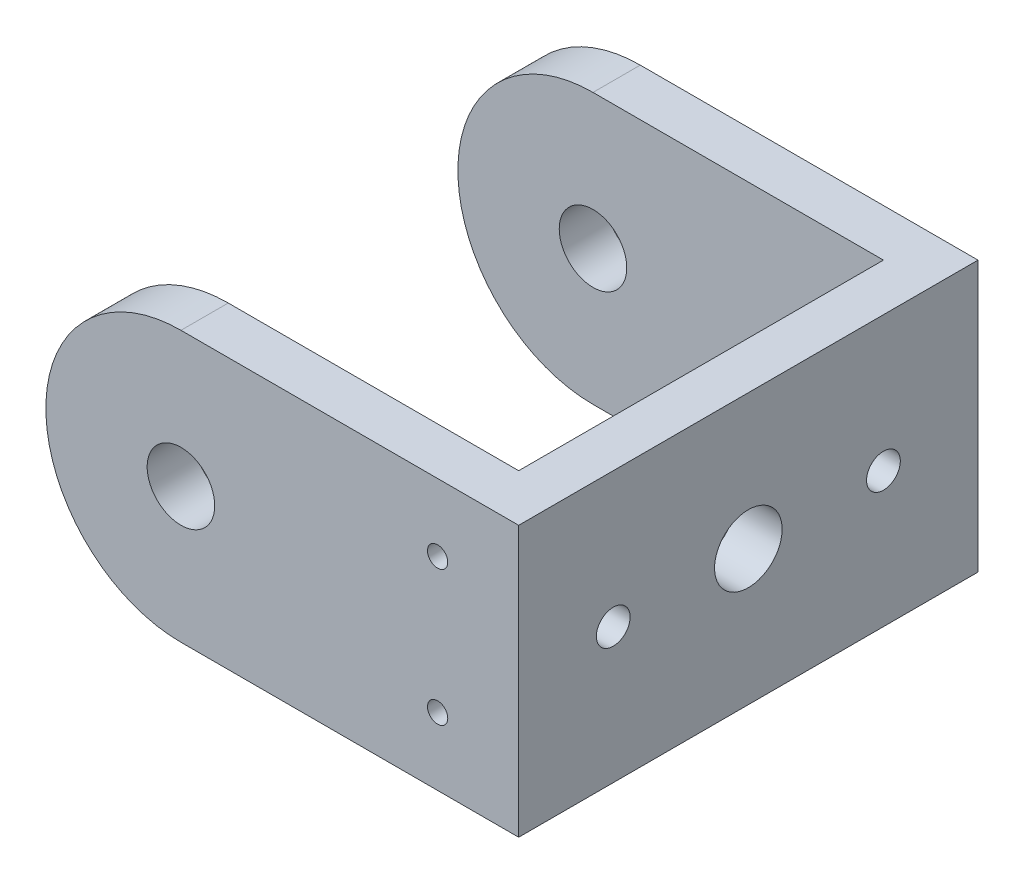
ISO-10303-21;
HEADER;
FILE_DESCRIPTION(('STEP AP214'),'2;1');
FILE_NAME('part.step','',(''),(''),'','','');
FILE_SCHEMA(('AUTOMOTIVE_DESIGN { 1 0 10303 214 1 1 1 1 }'));
ENDSEC;
DATA;
#1=APPLICATION_CONTEXT('core data for automotive mechanical design processes');
#2=APPLICATION_PROTOCOL_DEFINITION('international standard','automotive_design',2000,#1);
#3=PRODUCT_CONTEXT('',#1,'mechanical');
#4=PRODUCT('Part','Part','',(#3));
#5=PRODUCT_RELATED_PRODUCT_CATEGORY('part','',(#4));
#6=PRODUCT_DEFINITION_FORMATION('','',#4);
#7=PRODUCT_DEFINITION_CONTEXT('part definition',#1,'design');
#8=PRODUCT_DEFINITION('design','',#6,#7);
#9=PRODUCT_DEFINITION_SHAPE('','',#8);
#10=(LENGTH_UNIT() NAMED_UNIT(*) SI_UNIT(.MILLI.,.METRE.));
#11=(NAMED_UNIT(*) PLANE_ANGLE_UNIT() SI_UNIT($,.RADIAN.));
#12=(NAMED_UNIT(*) SI_UNIT($,.STERADIAN.) SOLID_ANGLE_UNIT());
#13=UNCERTAINTY_MEASURE_WITH_UNIT(LENGTH_MEASURE(1.E-05),#10,'distance_accuracy_value','');
#14=(GEOMETRIC_REPRESENTATION_CONTEXT(3) GLOBAL_UNCERTAINTY_ASSIGNED_CONTEXT((#13)) GLOBAL_UNIT_ASSIGNED_CONTEXT((#10,
#11,#12)) REPRESENTATION_CONTEXT('',''));
#15=CARTESIAN_POINT('',(0.,0.,0.));
#16=DIRECTION('',(0.,0.,1.));
#17=DIRECTION('',(1.,0.,0.));
#18=AXIS2_PLACEMENT_3D('',#15,#16,#17);
#19=CARTESIAN_POINT('',(-50.,-20.,68.));
#20=DIRECTION('',(0.,0.,-1.));
#21=DIRECTION('',(-1.,0.,0.));
#22=AXIS2_PLACEMENT_3D('',#19,#20,#21);
#23=CYLINDRICAL_SURFACE('',#22,20.);
#24=DIRECTION('',(0.,0.,-1.));
#25=VECTOR('',#24,1.);
#26=CARTESIAN_POINT('',(-50.,-40.,68.));
#27=LINE('',#26,#25);
#28=CARTESIAN_POINT('',(-50.,-40.,6.99999999999999));
#29=VERTEX_POINT('',#28);
#30=CARTESIAN_POINT('',(-50.,-40.,0.));
#31=VERTEX_POINT('',#30);
#32=EDGE_CURVE('E175',#29,#31,#27,.T.);
#33=ORIENTED_EDGE('',*,*,#32,.F.);
#34=CARTESIAN_POINT('',(-50.,-20.,6.99999999999999));
#35=DIRECTION('',(0.,0.,-1.));
#36=DIRECTION('',(-1.,0.,0.));
#37=AXIS2_PLACEMENT_3D('',#34,#35,#36);
#38=CIRCLE('',#37,20.);
#39=CARTESIAN_POINT('',(-50.,0.,6.99999999999999));
#40=VERTEX_POINT('',#39);
#41=EDGE_CURVE('E126',#29,#40,#38,.T.);
#42=ORIENTED_EDGE('',*,*,#41,.T.);
#43=DIRECTION('',(0.,0.,-1.));
#44=VECTOR('',#43,1.);
#45=CARTESIAN_POINT('',(-50.,0.,68.));
#46=LINE('',#45,#44);
#47=CARTESIAN_POINT('',(-50.,0.,0.));
#48=VERTEX_POINT('',#47);
#49=EDGE_CURVE('E46',#40,#48,#46,.T.);
#50=ORIENTED_EDGE('',*,*,#49,.T.);
#51=CARTESIAN_POINT('',(-50.,-20.,0.));
#52=DIRECTION('',(0.,0.,1.));
#53=DIRECTION('',(-1.,0.,0.));
#54=AXIS2_PLACEMENT_3D('',#51,#52,#53);
#55=CIRCLE('',#54,20.);
#56=EDGE_CURVE('E166',#48,#31,#55,.T.);
#57=ORIENTED_EDGE('',*,*,#56,.T.);
#58=EDGE_LOOP('',(#33,#42,#50,#57));
#59=FACE_BOUND('',#58,.T.);
#60=ADVANCED_FACE('F37',(#59),#23,.T.);
#61=CARTESIAN_POINT('',(-50.,-20.,68.));
#62=DIRECTION('',(0.,0.,-1.));
#63=DIRECTION('',(-1.,0.,0.));
#64=AXIS2_PLACEMENT_3D('',#61,#62,#63);
#65=CYLINDRICAL_SURFACE('',#64,5.);
#66=CARTESIAN_POINT('',(-50.,-20.,6.99999999999999));
#67=DIRECTION('',(0.,0.,-1.));
#68=DIRECTION('',(-1.,0.,0.));
#69=AXIS2_PLACEMENT_3D('',#66,#67,#68);
#70=CIRCLE('',#69,5.);
#71=CARTESIAN_POINT('',(-55.,-20.,6.99999999999999));
#72=VERTEX_POINT('',#71);
#73=EDGE_CURVE('E148',#72,#72,#70,.T.);
#74=ORIENTED_EDGE('',*,*,#73,.F.);
#75=EDGE_LOOP('',(#74));
#76=FACE_BOUND('',#75,.T.);
#77=CARTESIAN_POINT('',(-50.,-20.,0.));
#78=DIRECTION('',(0.,0.,1.));
#79=DIRECTION('',(1.,0.,0.));
#80=AXIS2_PLACEMENT_3D('',#77,#78,#79);
#81=CIRCLE('',#80,5.);
#82=CARTESIAN_POINT('',(-45.,-20.,0.));
#83=VERTEX_POINT('',#82);
#84=EDGE_CURVE('E150',#83,#83,#81,.T.);
#85=ORIENTED_EDGE('',*,*,#84,.F.);
#86=EDGE_LOOP('',(#85));
#87=FACE_BOUND('',#86,.T.);
#88=ADVANCED_FACE('F237',(#76,#87),#65,.F.);
#89=CARTESIAN_POINT('',(-50.,-20.,68.));
#90=DIRECTION('',(0.,0.,-1.));
#91=DIRECTION('',(-1.,0.,0.));
#92=AXIS2_PLACEMENT_3D('',#89,#90,#91);
#93=PLANE('',#92);
#94=CARTESIAN_POINT('',(-12.,-10.,68.));
#95=DIRECTION('',(0.,0.,-1.));
#96=DIRECTION('',(-1.,0.,0.));
#97=AXIS2_PLACEMENT_3D('',#94,#95,#96);
#98=CIRCLE('',#97,1.5);
#99=CARTESIAN_POINT('',(-13.5,-10.,68.));
#100=VERTEX_POINT('',#99);
#101=EDGE_CURVE('E193',#100,#100,#98,.T.);
#102=ORIENTED_EDGE('',*,*,#101,.T.);
#103=EDGE_LOOP('',(#102));
#104=FACE_BOUND('',#103,.T.);
#105=CARTESIAN_POINT('',(-12.,-30.,68.));
#106=DIRECTION('',(0.,0.,-1.));
#107=DIRECTION('',(1.,0.,0.));
#108=AXIS2_PLACEMENT_3D('',#105,#106,#107);
#109=CIRCLE('',#108,1.5);
#110=CARTESIAN_POINT('',(-10.5,-30.,68.));
#111=VERTEX_POINT('',#110);
#112=EDGE_CURVE('E209',#111,#111,#109,.T.);
#113=ORIENTED_EDGE('',*,*,#112,.T.);
#114=EDGE_LOOP('',(#113));
#115=FACE_BOUND('',#114,.T.);
#116=DIRECTION('',(-1.,0.,0.));
#117=VECTOR('',#116,1.);
#118=CARTESIAN_POINT('',(-50.,0.,68.));
#119=LINE('',#118,#117);
#120=CARTESIAN_POINT('',(0.,0.,68.));
#121=VERTEX_POINT('',#120);
#122=CARTESIAN_POINT('',(-50.,0.,68.));
#123=VERTEX_POINT('',#122);
#124=EDGE_CURVE('E157',#121,#123,#119,.T.);
#125=ORIENTED_EDGE('',*,*,#124,.T.);
#126=CARTESIAN_POINT('',(-50.,-20.,68.));
#127=DIRECTION('',(0.,0.,1.));
#128=DIRECTION('',(-1.,0.,0.));
#129=AXIS2_PLACEMENT_3D('',#126,#127,#128);
#130=CIRCLE('',#129,20.);
#131=CARTESIAN_POINT('',(-50.,-40.,68.));
#132=VERTEX_POINT('',#131);
#133=EDGE_CURVE('E91',#123,#132,#130,.T.);
#134=ORIENTED_EDGE('',*,*,#133,.T.);
#135=DIRECTION('',(1.,0.,0.));
#136=VECTOR('',#135,1.);
#137=CARTESIAN_POINT('',(0.,-40.,68.));
#138=LINE('',#137,#136);
#139=CARTESIAN_POINT('',(0.,-40.,68.));
#140=VERTEX_POINT('',#139);
#141=EDGE_CURVE('E160',#132,#140,#138,.T.);
#142=ORIENTED_EDGE('',*,*,#141,.T.);
#143=DIRECTION('',(0.,1.,0.));
#144=VECTOR('',#143,1.);
#145=CARTESIAN_POINT('',(0.,0.,68.));
#146=LINE('',#145,#144);
#147=EDGE_CURVE('E63',#140,#121,#146,.T.);
#148=ORIENTED_EDGE('',*,*,#147,.T.);
#149=EDGE_LOOP('',(#125,#134,#142,#148));
#150=FACE_BOUND('',#149,.T.);
#151=CARTESIAN_POINT('',(-50.,-20.,68.));
#152=DIRECTION('',(0.,0.,1.));
#153=DIRECTION('',(1.,0.,0.));
#154=AXIS2_PLACEMENT_3D('',#151,#152,#153);
#155=CIRCLE('',#154,5.);
#156=CARTESIAN_POINT('',(-45.,-20.,68.));
#157=VERTEX_POINT('',#156);
#158=EDGE_CURVE('E151',#157,#157,#155,.T.);
#159=ORIENTED_EDGE('',*,*,#158,.F.);
#160=EDGE_LOOP('',(#159));
#161=FACE_BOUND('',#160,.T.);
#162=ADVANCED_FACE('F248',(#104,#115,#150,#161),#93,.F.);
#163=CARTESIAN_POINT('',(-50.,-20.,0.));
#164=DIRECTION('',(0.,0.,-1.));
#165=DIRECTION('',(-1.,0.,0.));
#166=AXIS2_PLACEMENT_3D('',#163,#164,#165);
#167=PLANE('',#166);
#168=CARTESIAN_POINT('',(-12.,-10.,0.));
#169=DIRECTION('',(0.,0.,-1.));
#170=DIRECTION('',(-1.,0.,0.));
#171=AXIS2_PLACEMENT_3D('',#168,#169,#170);
#172=CIRCLE('',#171,1.5);
#173=CARTESIAN_POINT('',(-13.5,-10.,0.));
#174=VERTEX_POINT('',#173);
#175=EDGE_CURVE('E199',#174,#174,#172,.T.);
#176=ORIENTED_EDGE('',*,*,#175,.F.);
#177=EDGE_LOOP('',(#176));
#178=FACE_BOUND('',#177,.T.);
#179=CARTESIAN_POINT('',(-12.,-30.,0.));
#180=DIRECTION('',(0.,0.,-1.));
#181=DIRECTION('',(1.,0.,0.));
#182=AXIS2_PLACEMENT_3D('',#179,#180,#181);
#183=CIRCLE('',#182,1.5);
#184=CARTESIAN_POINT('',(-10.5,-30.,0.));
#185=VERTEX_POINT('',#184);
#186=EDGE_CURVE('E204',#185,#185,#183,.T.);
#187=ORIENTED_EDGE('',*,*,#186,.F.);
#188=EDGE_LOOP('',(#187));
#189=FACE_BOUND('',#188,.T.);
#190=DIRECTION('',(-1.,0.,0.));
#191=VECTOR('',#190,1.);
#192=CARTESIAN_POINT('',(-50.,0.,0.));
#193=LINE('',#192,#191);
#194=CARTESIAN_POINT('',(0.,0.,0.));
#195=VERTEX_POINT('',#194);
#196=EDGE_CURVE('E154',#195,#48,#193,.T.);
#197=ORIENTED_EDGE('',*,*,#196,.F.);
#198=DIRECTION('',(0.,1.,0.));
#199=VECTOR('',#198,1.);
#200=CARTESIAN_POINT('',(0.,0.,0.));
#201=LINE('',#200,#199);
#202=CARTESIAN_POINT('',(0.,-40.,0.));
#203=VERTEX_POINT('',#202);
#204=EDGE_CURVE('E84',#203,#195,#201,.T.);
#205=ORIENTED_EDGE('',*,*,#204,.F.);
#206=DIRECTION('',(1.,0.,0.));
#207=VECTOR('',#206,1.);
#208=CARTESIAN_POINT('',(0.,-40.,0.));
#209=LINE('',#208,#207);
#210=EDGE_CURVE('E169',#31,#203,#209,.T.);
#211=ORIENTED_EDGE('',*,*,#210,.F.);
#212=ORIENTED_EDGE('',*,*,#56,.F.);
#213=EDGE_LOOP('',(#197,#205,#211,#212));
#214=FACE_BOUND('',#213,.T.);
#215=ORIENTED_EDGE('',*,*,#84,.T.);
#216=EDGE_LOOP('',(#215));
#217=FACE_BOUND('',#216,.T.);
#218=ADVANCED_FACE('F254',(#178,#189,#214,#217),#167,.T.);
#219=CARTESIAN_POINT('',(-50.,0.,68.));
#220=DIRECTION('',(0.,-1.,0.));
#221=DIRECTION('',(0.,0.,-1.));
#222=AXIS2_PLACEMENT_3D('',#219,#220,#221);
#223=PLANE('',#222);
#224=ORIENTED_EDGE('',*,*,#49,.F.);
#225=DIRECTION('',(-1.,0.,0.));
#226=VECTOR('',#225,1.);
#227=CARTESIAN_POINT('',(-75.7688155447121,0.,7.));
#228=LINE('',#227,#226);
#229=CARTESIAN_POINT('',(-7.00000000000003,0.,6.99999999999997));
#230=VERTEX_POINT('',#229);
#231=EDGE_CURVE('E135',#230,#40,#228,.T.);
#232=ORIENTED_EDGE('',*,*,#231,.F.);
#233=DIRECTION('',(0.,0.,-1.));
#234=VECTOR('',#233,1.);
#235=CARTESIAN_POINT('',(-7.00000000000003,0.,6.99999999999997));
#236=LINE('',#235,#234);
#237=CARTESIAN_POINT('',(-7.00000000000002,0.,61.));
#238=VERTEX_POINT('',#237);
#239=EDGE_CURVE('E116',#238,#230,#236,.T.);
#240=ORIENTED_EDGE('',*,*,#239,.F.);
#241=DIRECTION('',(1.,0.,0.));
#242=VECTOR('',#241,1.);
#243=CARTESIAN_POINT('',(-75.7688155447121,0.,61.));
#244=LINE('',#243,#242);
#245=CARTESIAN_POINT('',(-50.,0.,61.));
#246=VERTEX_POINT('',#245);
#247=EDGE_CURVE('E139',#246,#238,#244,.T.);
#248=ORIENTED_EDGE('',*,*,#247,.F.);
#249=EDGE_CURVE('E11',#123,#246,#46,.T.);
#250=ORIENTED_EDGE('',*,*,#249,.F.);
#251=ORIENTED_EDGE('',*,*,#124,.F.);
#252=DIRECTION('',(0.,0.,-1.));
#253=VECTOR('',#252,1.);
#254=CARTESIAN_POINT('',(0.,0.,68.));
#255=LINE('',#254,#253);
#256=EDGE_CURVE('E163',#121,#195,#255,.T.);
#257=ORIENTED_EDGE('',*,*,#256,.T.);
#258=ORIENTED_EDGE('',*,*,#196,.T.);
#259=EDGE_LOOP('',(#224,#232,#240,#248,#250,#251,#257,#258));
#260=FACE_BOUND('',#259,.T.);
#261=ADVANCED_FACE('F39',(#260),#223,.F.);
#262=ORIENTED_EDGE('',*,*,#249,.T.);
#263=CARTESIAN_POINT('',(-50.,-20.,61.));
#264=DIRECTION('',(0.,0.,1.));
#265=DIRECTION('',(1.,0.,0.));
#266=AXIS2_PLACEMENT_3D('',#263,#264,#265);
#267=CIRCLE('',#266,20.);
#268=CARTESIAN_POINT('',(-50.,-40.,61.));
#269=VERTEX_POINT('',#268);
#270=EDGE_CURVE('E145',#246,#269,#267,.T.);
#271=ORIENTED_EDGE('',*,*,#270,.T.);
#272=EDGE_CURVE('E176',#132,#269,#27,.T.);
#273=ORIENTED_EDGE('',*,*,#272,.F.);
#274=ORIENTED_EDGE('',*,*,#133,.F.);
#275=EDGE_LOOP('',(#262,#271,#273,#274));
#276=FACE_BOUND('',#275,.T.);
#277=ADVANCED_FACE('F238',(#276),#23,.T.);
#278=CARTESIAN_POINT('',(0.,-40.,68.));
#279=DIRECTION('',(0.,1.,0.));
#280=DIRECTION('',(-1.,0.,0.));
#281=AXIS2_PLACEMENT_3D('',#278,#279,#280);
#282=PLANE('',#281);
#283=DIRECTION('',(0.,0.,-1.));
#284=VECTOR('',#283,1.);
#285=CARTESIAN_POINT('',(-7.00000000000003,-40.,6.99999999999997));
#286=LINE('',#285,#284);
#287=CARTESIAN_POINT('',(-7.00000000000002,-40.,61.));
#288=VERTEX_POINT('',#287);
#289=CARTESIAN_POINT('',(-7.00000000000003,-40.,6.99999999999997));
#290=VERTEX_POINT('',#289);
#291=EDGE_CURVE('E54',#288,#290,#286,.T.);
#292=ORIENTED_EDGE('',*,*,#291,.T.);
#293=DIRECTION('',(-1.,0.,0.));
#294=VECTOR('',#293,1.);
#295=CARTESIAN_POINT('',(-75.7688155447121,-40.,7.));
#296=LINE('',#295,#294);
#297=EDGE_CURVE('E123',#290,#29,#296,.T.);
#298=ORIENTED_EDGE('',*,*,#297,.T.);
#299=ORIENTED_EDGE('',*,*,#32,.T.);
#300=ORIENTED_EDGE('',*,*,#210,.T.);
#301=DIRECTION('',(0.,0.,-1.));
#302=VECTOR('',#301,1.);
#303=CARTESIAN_POINT('',(0.,-40.,68.));
#304=LINE('',#303,#302);
#305=EDGE_CURVE('E173',#140,#203,#304,.T.);
#306=ORIENTED_EDGE('',*,*,#305,.F.);
#307=ORIENTED_EDGE('',*,*,#141,.F.);
#308=ORIENTED_EDGE('',*,*,#272,.T.);
#309=DIRECTION('',(1.,0.,0.));
#310=VECTOR('',#309,1.);
#311=CARTESIAN_POINT('',(-75.7688155447121,-40.,61.));
#312=LINE('',#311,#310);
#313=EDGE_CURVE('E133',#269,#288,#312,.T.);
#314=ORIENTED_EDGE('',*,*,#313,.T.);
#315=EDGE_LOOP('',(#292,#298,#299,#300,#306,#307,#308,#314));
#316=FACE_BOUND('',#315,.T.);
#317=ADVANCED_FACE('F131',(#316),#282,.F.);
#318=CARTESIAN_POINT('',(0.,0.,68.));
#319=DIRECTION('',(-1.,0.,0.));
#320=DIRECTION('',(0.,-1.,0.));
#321=AXIS2_PLACEMENT_3D('',#318,#319,#320);
#322=PLANE('',#321);
#323=CARTESIAN_POINT('',(0.,-20.,14.));
#324=DIRECTION('',(1.,0.,0.));
#325=DIRECTION('',(0.,-1.,0.));
#326=AXIS2_PLACEMENT_3D('',#323,#324,#325);
#327=CIRCLE('',#326,2.5);
#328=CARTESIAN_POINT('',(0.,-22.5,14.));
#329=VERTEX_POINT('',#328);
#330=EDGE_CURVE('E215',#329,#329,#327,.T.);
#331=ORIENTED_EDGE('',*,*,#330,.F.);
#332=EDGE_LOOP('',(#331));
#333=FACE_BOUND('',#332,.T.);
#334=CARTESIAN_POINT('',(0.,-20.,54.));
#335=DIRECTION('',(1.,0.,0.));
#336=DIRECTION('',(0.,1.,0.));
#337=AXIS2_PLACEMENT_3D('',#334,#335,#336);
#338=CIRCLE('',#337,2.5);
#339=CARTESIAN_POINT('',(0.,-17.5,54.));
#340=VERTEX_POINT('',#339);
#341=EDGE_CURVE('E216',#340,#340,#338,.T.);
#342=ORIENTED_EDGE('',*,*,#341,.F.);
#343=EDGE_LOOP('',(#342));
#344=FACE_BOUND('',#343,.T.);
#345=CARTESIAN_POINT('',(0.,-20.,34.));
#346=DIRECTION('',(1.,0.,0.));
#347=DIRECTION('',(0.,1.,0.));
#348=AXIS2_PLACEMENT_3D('',#345,#346,#347);
#349=CIRCLE('',#348,5.);
#350=CARTESIAN_POINT('',(0.,-15.,34.));
#351=VERTEX_POINT('',#350);
#352=EDGE_CURVE('E186',#351,#351,#349,.T.);
#353=ORIENTED_EDGE('',*,*,#352,.F.);
#354=EDGE_LOOP('',(#353));
#355=FACE_BOUND('',#354,.T.);
#356=ORIENTED_EDGE('',*,*,#204,.T.);
#357=ORIENTED_EDGE('',*,*,#256,.F.);
#358=ORIENTED_EDGE('',*,*,#147,.F.);
#359=ORIENTED_EDGE('',*,*,#305,.T.);
#360=EDGE_LOOP('',(#356,#357,#358,#359));
#361=FACE_BOUND('',#360,.T.);
#362=ADVANCED_FACE('F226',(#333,#344,#355,#361),#322,.F.);
#363=CARTESIAN_POINT('',(-50.,-20.,61.));
#364=DIRECTION('',(0.,0.,1.));
#365=DIRECTION('',(1.,0.,0.));
#366=AXIS2_PLACEMENT_3D('',#363,#364,#365);
#367=CIRCLE('',#366,5.);
#368=CARTESIAN_POINT('',(-45.,-20.,61.));
#369=VERTEX_POINT('',#368);
#370=EDGE_CURVE('E119',#369,#369,#367,.T.);
#371=ORIENTED_EDGE('',*,*,#370,.F.);
#372=EDGE_LOOP('',(#371));
#373=FACE_BOUND('',#372,.T.);
#374=ORIENTED_EDGE('',*,*,#158,.T.);
#375=EDGE_LOOP('',(#374));
#376=FACE_BOUND('',#375,.T.);
#377=ADVANCED_FACE('F228',(#373,#376),#65,.F.);
#378=CARTESIAN_POINT('',(-75.7688155447121,-40.,7.));
#379=DIRECTION('',(0.,0.,-1.));
#380=DIRECTION('',(-1.,0.,0.));
#381=AXIS2_PLACEMENT_3D('',#378,#379,#380);
#382=PLANE('',#381);
#383=CARTESIAN_POINT('',(-12.,-10.,6.99999999999997));
#384=DIRECTION('',(0.,0.,-1.));
#385=DIRECTION('',(-1.,0.,0.));
#386=AXIS2_PLACEMENT_3D('',#383,#384,#385);
#387=CIRCLE('',#386,1.5);
#388=CARTESIAN_POINT('',(-13.5,-10.,6.99999999999997));
#389=VERTEX_POINT('',#388);
#390=EDGE_CURVE('E212',#389,#389,#387,.T.);
#391=ORIENTED_EDGE('',*,*,#390,.T.);
#392=EDGE_LOOP('',(#391));
#393=FACE_BOUND('',#392,.T.);
#394=CARTESIAN_POINT('',(-12.,-30.,6.99999999999997));
#395=DIRECTION('',(0.,0.,-1.));
#396=DIRECTION('',(-1.,0.,0.));
#397=AXIS2_PLACEMENT_3D('',#394,#395,#396);
#398=CIRCLE('',#397,1.5);
#399=CARTESIAN_POINT('',(-13.5,-30.,6.99999999999997));
#400=VERTEX_POINT('',#399);
#401=EDGE_CURVE('E192',#400,#400,#398,.T.);
#402=ORIENTED_EDGE('',*,*,#401,.T.);
#403=EDGE_LOOP('',(#402));
#404=FACE_BOUND('',#403,.T.);
#405=ORIENTED_EDGE('',*,*,#73,.T.);
#406=EDGE_LOOP('',(#405));
#407=FACE_BOUND('',#406,.T.);
#408=ORIENTED_EDGE('',*,*,#297,.F.);
#409=DIRECTION('',(0.,1.,0.));
#410=VECTOR('',#409,1.);
#411=CARTESIAN_POINT('',(-7.00000000000003,-40.,6.99999999999997));
#412=LINE('',#411,#410);
#413=EDGE_CURVE('E112',#290,#230,#412,.T.);
#414=ORIENTED_EDGE('',*,*,#413,.T.);
#415=ORIENTED_EDGE('',*,*,#231,.T.);
#416=ORIENTED_EDGE('',*,*,#41,.F.);
#417=EDGE_LOOP('',(#408,#414,#415,#416));
#418=FACE_BOUND('',#417,.T.);
#419=ADVANCED_FACE('F124',(#393,#404,#407,#418),#382,.F.);
#420=CARTESIAN_POINT('',(-75.7688155447121,-40.,61.));
#421=DIRECTION('',(0.,0.,1.));
#422=DIRECTION('',(1.,0.,0.));
#423=AXIS2_PLACEMENT_3D('',#420,#421,#422);
#424=PLANE('',#423);
#425=CARTESIAN_POINT('',(-12.,-10.,61.));
#426=DIRECTION('',(0.,0.,1.));
#427=DIRECTION('',(1.,0.,0.));
#428=AXIS2_PLACEMENT_3D('',#425,#426,#427);
#429=CIRCLE('',#428,1.5);
#430=CARTESIAN_POINT('',(-10.5,-10.,61.));
#431=VERTEX_POINT('',#430);
#432=EDGE_CURVE('E41',#431,#431,#429,.T.);
#433=ORIENTED_EDGE('',*,*,#432,.T.);
#434=EDGE_LOOP('',(#433));
#435=FACE_BOUND('',#434,.T.);
#436=CARTESIAN_POINT('',(-12.,-30.,61.));
#437=DIRECTION('',(0.,0.,1.));
#438=DIRECTION('',(1.,0.,0.));
#439=AXIS2_PLACEMENT_3D('',#436,#437,#438);
#440=CIRCLE('',#439,1.5);
#441=CARTESIAN_POINT('',(-10.5,-30.,61.));
#442=VERTEX_POINT('',#441);
#443=EDGE_CURVE('E190',#442,#442,#440,.T.);
#444=ORIENTED_EDGE('',*,*,#443,.T.);
#445=EDGE_LOOP('',(#444));
#446=FACE_BOUND('',#445,.T.);
#447=ORIENTED_EDGE('',*,*,#370,.T.);
#448=EDGE_LOOP('',(#447));
#449=FACE_BOUND('',#448,.T.);
#450=ORIENTED_EDGE('',*,*,#247,.T.);
#451=DIRECTION('',(0.,1.,0.));
#452=VECTOR('',#451,1.);
#453=CARTESIAN_POINT('',(-7.00000000000002,-40.,61.));
#454=LINE('',#453,#452);
#455=EDGE_CURVE('E120',#288,#238,#454,.T.);
#456=ORIENTED_EDGE('',*,*,#455,.F.);
#457=ORIENTED_EDGE('',*,*,#313,.F.);
#458=ORIENTED_EDGE('',*,*,#270,.F.);
#459=EDGE_LOOP('',(#450,#456,#457,#458));
#460=FACE_BOUND('',#459,.T.);
#461=ADVANCED_FACE('F261',(#435,#446,#449,#460),#424,.F.);
#462=CARTESIAN_POINT('',(-7.00000000000003,-40.,6.99999999999997));
#463=DIRECTION('',(1.,0.,0.));
#464=DIRECTION('',(0.,0.,-1.));
#465=AXIS2_PLACEMENT_3D('',#462,#463,#464);
#466=PLANE('',#465);
#467=CARTESIAN_POINT('',(-7.00000000000002,-20.,14.));
#468=DIRECTION('',(1.,0.,0.));
#469=DIRECTION('',(0.,0.,-1.));
#470=AXIS2_PLACEMENT_3D('',#467,#468,#469);
#471=CIRCLE('',#470,2.5);
#472=CARTESIAN_POINT('',(-7.00000000000002,-20.,11.5));
#473=VERTEX_POINT('',#472);
#474=EDGE_CURVE('E141',#473,#473,#471,.T.);
#475=ORIENTED_EDGE('',*,*,#474,.T.);
#476=EDGE_LOOP('',(#475));
#477=FACE_BOUND('',#476,.T.);
#478=CARTESIAN_POINT('',(-7.00000000000002,-20.,54.));
#479=DIRECTION('',(1.,0.,0.));
#480=DIRECTION('',(0.,0.,-1.));
#481=AXIS2_PLACEMENT_3D('',#478,#479,#480);
#482=CIRCLE('',#481,2.5);
#483=CARTESIAN_POINT('',(-7.00000000000002,-20.,51.5));
#484=VERTEX_POINT('',#483);
#485=EDGE_CURVE('E185',#484,#484,#482,.T.);
#486=ORIENTED_EDGE('',*,*,#485,.T.);
#487=EDGE_LOOP('',(#486));
#488=FACE_BOUND('',#487,.T.);
#489=CARTESIAN_POINT('',(-7.00000000000002,-20.,34.));
#490=DIRECTION('',(1.,0.,0.));
#491=DIRECTION('',(0.,0.,-1.));
#492=AXIS2_PLACEMENT_3D('',#489,#490,#491);
#493=CIRCLE('',#492,5.);
#494=CARTESIAN_POINT('',(-7.00000000000002,-20.,29.));
#495=VERTEX_POINT('',#494);
#496=EDGE_CURVE('E182',#495,#495,#493,.T.);
#497=ORIENTED_EDGE('',*,*,#496,.T.);
#498=EDGE_LOOP('',(#497));
#499=FACE_BOUND('',#498,.T.);
#500=ORIENTED_EDGE('',*,*,#239,.T.);
#501=ORIENTED_EDGE('',*,*,#413,.F.);
#502=ORIENTED_EDGE('',*,*,#291,.F.);
#503=ORIENTED_EDGE('',*,*,#455,.T.);
#504=EDGE_LOOP('',(#500,#501,#502,#503));
#505=FACE_BOUND('',#504,.T.);
#506=ADVANCED_FACE('F114',(#477,#488,#499,#505),#466,.F.);
#507=CARTESIAN_POINT('',(-70.,-20.,34.));
#508=DIRECTION('',(1.,0.,0.));
#509=DIRECTION('',(0.,1.,0.));
#510=AXIS2_PLACEMENT_3D('',#507,#508,#509);
#511=CYLINDRICAL_SURFACE('',#510,5.);
#512=ORIENTED_EDGE('',*,*,#352,.T.);
#513=EDGE_LOOP('',(#512));
#514=FACE_BOUND('',#513,.T.);
#515=ORIENTED_EDGE('',*,*,#496,.F.);
#516=EDGE_LOOP('',(#515));
#517=FACE_BOUND('',#516,.T.);
#518=ADVANCED_FACE('F223',(#514,#517),#511,.F.);
#519=CARTESIAN_POINT('',(-70.,-20.,54.));
#520=DIRECTION('',(1.,0.,0.));
#521=DIRECTION('',(0.,1.,0.));
#522=AXIS2_PLACEMENT_3D('',#519,#520,#521);
#523=CYLINDRICAL_SURFACE('',#522,2.5);
#524=ORIENTED_EDGE('',*,*,#341,.T.);
#525=EDGE_LOOP('',(#524));
#526=FACE_BOUND('',#525,.T.);
#527=ORIENTED_EDGE('',*,*,#485,.F.);
#528=EDGE_LOOP('',(#527));
#529=FACE_BOUND('',#528,.T.);
#530=ADVANCED_FACE('F321',(#526,#529),#523,.F.);
#531=CARTESIAN_POINT('',(-70.,-20.,14.));
#532=DIRECTION('',(1.,0.,0.));
#533=DIRECTION('',(0.,1.,0.));
#534=AXIS2_PLACEMENT_3D('',#531,#532,#533);
#535=CYLINDRICAL_SURFACE('',#534,2.5);
#536=ORIENTED_EDGE('',*,*,#330,.T.);
#537=EDGE_LOOP('',(#536));
#538=FACE_BOUND('',#537,.T.);
#539=ORIENTED_EDGE('',*,*,#474,.F.);
#540=EDGE_LOOP('',(#539));
#541=FACE_BOUND('',#540,.T.);
#542=ADVANCED_FACE('F317',(#538,#541),#535,.F.);
#543=CARTESIAN_POINT('',(-12.,-30.,68.));
#544=DIRECTION('',(0.,0.,-1.));
#545=DIRECTION('',(-1.,0.,0.));
#546=AXIS2_PLACEMENT_3D('',#543,#544,#545);
#547=CYLINDRICAL_SURFACE('',#546,1.5);
#548=ORIENTED_EDGE('',*,*,#112,.F.);
#549=EDGE_LOOP('',(#548));
#550=FACE_BOUND('',#549,.T.);
#551=ORIENTED_EDGE('',*,*,#443,.F.);
#552=EDGE_LOOP('',(#551));
#553=FACE_BOUND('',#552,.T.);
#554=ADVANCED_FACE('F303',(#550,#553),#547,.F.);
#555=CARTESIAN_POINT('',(-12.,-10.,68.));
#556=DIRECTION('',(0.,0.,-1.));
#557=DIRECTION('',(-1.,0.,0.));
#558=AXIS2_PLACEMENT_3D('',#555,#556,#557);
#559=CYLINDRICAL_SURFACE('',#558,1.5);
#560=ORIENTED_EDGE('',*,*,#101,.F.);
#561=EDGE_LOOP('',(#560));
#562=FACE_BOUND('',#561,.T.);
#563=ORIENTED_EDGE('',*,*,#432,.F.);
#564=EDGE_LOOP('',(#563));
#565=FACE_BOUND('',#564,.T.);
#566=ADVANCED_FACE('F301',(#562,#565),#559,.F.);
#567=ORIENTED_EDGE('',*,*,#186,.T.);
#568=EDGE_LOOP('',(#567));
#569=FACE_BOUND('',#568,.T.);
#570=ORIENTED_EDGE('',*,*,#401,.F.);
#571=EDGE_LOOP('',(#570));
#572=FACE_BOUND('',#571,.T.);
#573=ADVANCED_FACE('F297',(#569,#572),#547,.F.);
#574=ORIENTED_EDGE('',*,*,#175,.T.);
#575=EDGE_LOOP('',(#574));
#576=FACE_BOUND('',#575,.T.);
#577=ORIENTED_EDGE('',*,*,#390,.F.);
#578=EDGE_LOOP('',(#577));
#579=FACE_BOUND('',#578,.T.);
#580=ADVANCED_FACE('F300',(#576,#579),#559,.F.);
#581=CLOSED_SHELL('',(#60,#88,#162,#218,#261,#277,#317,#362,#377,#419,#461,#506,#518,#530,#542,
#554,#566,#573,#580));
#582=MANIFOLD_SOLID_BREP('B2',#581);
#583=ADVANCED_BREP_SHAPE_REPRESENTATION('',(#18,#582),#14);
#584=SHAPE_DEFINITION_REPRESENTATION(#9,#583);
ENDSEC;
END-ISO-10303-21;
